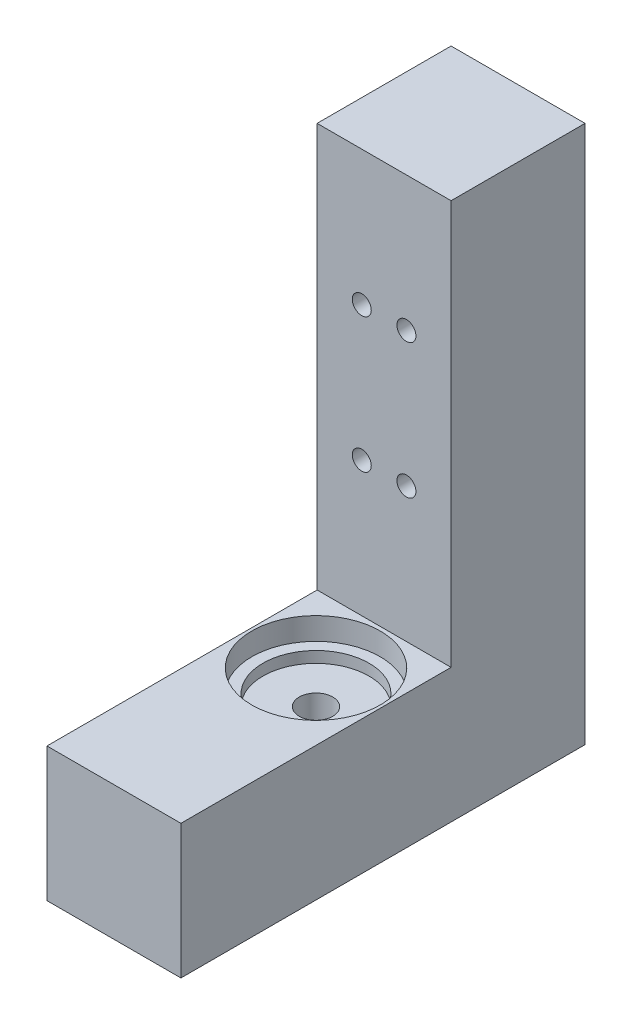
ISO-10303-21;
HEADER;
FILE_DESCRIPTION(('STEP AP214'),'2;1');
FILE_NAME('part.step','',(''),(''),'','','');
FILE_SCHEMA(('AUTOMOTIVE_DESIGN { 1 0 10303 214 1 1 1 1 }'));
ENDSEC;
DATA;
#1=APPLICATION_CONTEXT('core data for automotive mechanical design processes');
#2=APPLICATION_PROTOCOL_DEFINITION('international standard','automotive_design',2000,#1);
#3=PRODUCT_CONTEXT('',#1,'mechanical');
#4=PRODUCT('Part','Part','',(#3));
#5=PRODUCT_RELATED_PRODUCT_CATEGORY('part','',(#4));
#6=PRODUCT_DEFINITION_FORMATION('','',#4);
#7=PRODUCT_DEFINITION_CONTEXT('part definition',#1,'design');
#8=PRODUCT_DEFINITION('design','',#6,#7);
#9=PRODUCT_DEFINITION_SHAPE('','',#8);
#10=(LENGTH_UNIT() NAMED_UNIT(*) SI_UNIT(.MILLI.,.METRE.));
#11=(NAMED_UNIT(*) PLANE_ANGLE_UNIT() SI_UNIT($,.RADIAN.));
#12=(NAMED_UNIT(*) SI_UNIT($,.STERADIAN.) SOLID_ANGLE_UNIT());
#13=UNCERTAINTY_MEASURE_WITH_UNIT(LENGTH_MEASURE(1.E-05),#10,'distance_accuracy_value','');
#14=(GEOMETRIC_REPRESENTATION_CONTEXT(3) GLOBAL_UNCERTAINTY_ASSIGNED_CONTEXT((#13)) GLOBAL_UNIT_ASSIGNED_CONTEXT((#10,
#11,#12)) REPRESENTATION_CONTEXT('',''));
#15=CARTESIAN_POINT('',(0.,0.,0.));
#16=DIRECTION('',(0.,0.,1.));
#17=DIRECTION('',(1.,0.,0.));
#18=AXIS2_PLACEMENT_3D('',#15,#16,#17);
#19=CARTESIAN_POINT('',(16.,48.1366666666667,0.));
#20=DIRECTION('',(0.,0.,1.));
#21=DIRECTION('',(1.,0.,0.));
#22=AXIS2_PLACEMENT_3D('',#19,#20,#21);
#23=CYLINDRICAL_SURFACE('',#22,1.7);
#24=CARTESIAN_POINT('',(16.,48.1366666666667,0.));
#25=DIRECTION('',(0.,0.,1.));
#26=DIRECTION('',(1.,0.,0.));
#27=AXIS2_PLACEMENT_3D('',#24,#25,#26);
#28=CIRCLE('',#27,1.7);
#29=CARTESIAN_POINT('',(17.7,48.1366666666667,0.));
#30=VERTEX_POINT('',#29);
#31=EDGE_CURVE('E49',#30,#30,#28,.T.);
#32=ORIENTED_EDGE('',*,*,#31,.F.);
#33=EDGE_LOOP('',(#32));
#34=FACE_BOUND('',#33,.T.);
#35=CARTESIAN_POINT('',(16.,48.1366666666667,24.));
#36=DIRECTION('',(0.,0.,-1.));
#37=DIRECTION('',(-1.,0.,0.));
#38=AXIS2_PLACEMENT_3D('',#35,#36,#37);
#39=CIRCLE('',#38,1.7);
#40=CARTESIAN_POINT('',(14.3,48.1366666666667,24.));
#41=VERTEX_POINT('',#40);
#42=EDGE_CURVE('E11',#41,#41,#39,.T.);
#43=ORIENTED_EDGE('',*,*,#42,.F.);
#44=EDGE_LOOP('',(#43));
#45=FACE_BOUND('',#44,.T.);
#46=ADVANCED_FACE('F41',(#34,#45),#23,.F.);
#47=CARTESIAN_POINT('',(8.,48.1366666666667,0.));
#48=DIRECTION('',(0.,0.,1.));
#49=DIRECTION('',(1.,0.,0.));
#50=AXIS2_PLACEMENT_3D('',#47,#48,#49);
#51=CYLINDRICAL_SURFACE('',#50,1.7);
#52=CARTESIAN_POINT('',(8.,48.1366666666667,0.));
#53=DIRECTION('',(0.,0.,1.));
#54=DIRECTION('',(1.,0.,0.));
#55=AXIS2_PLACEMENT_3D('',#52,#53,#54);
#56=CIRCLE('',#55,1.7);
#57=CARTESIAN_POINT('',(9.70000000000001,48.1366666666667,0.));
#58=VERTEX_POINT('',#57);
#59=EDGE_CURVE('E165',#58,#58,#56,.T.);
#60=ORIENTED_EDGE('',*,*,#59,.F.);
#61=EDGE_LOOP('',(#60));
#62=FACE_BOUND('',#61,.T.);
#63=CARTESIAN_POINT('',(8.,48.1366666666667,24.));
#64=DIRECTION('',(0.,0.,-1.));
#65=DIRECTION('',(-1.,0.,0.));
#66=AXIS2_PLACEMENT_3D('',#63,#64,#65);
#67=CIRCLE('',#66,1.7);
#68=CARTESIAN_POINT('',(6.3,48.1366666666667,24.));
#69=VERTEX_POINT('',#68);
#70=EDGE_CURVE('E174',#69,#69,#67,.T.);
#71=ORIENTED_EDGE('',*,*,#70,.F.);
#72=EDGE_LOOP('',(#71));
#73=FACE_BOUND('',#72,.T.);
#74=ADVANCED_FACE('F186',(#62,#73),#51,.F.);
#75=CARTESIAN_POINT('',(24.,24.,0.));
#76=DIRECTION('',(0.,-1.,0.));
#77=DIRECTION('',(0.,0.,-1.));
#78=AXIS2_PLACEMENT_3D('',#75,#76,#77);
#79=PLANE('',#78);
#80=CARTESIAN_POINT('',(12.,24.,36.2));
#81=DIRECTION('',(0.,1.,0.));
#82=DIRECTION('',(0.,0.,1.));
#83=AXIS2_PLACEMENT_3D('',#80,#81,#82);
#84=CIRCLE('',#83,11.5);
#85=CARTESIAN_POINT('',(12.,24.,47.7));
#86=VERTEX_POINT('',#85);
#87=EDGE_CURVE('E390',#86,#86,#84,.T.);
#88=ORIENTED_EDGE('',*,*,#87,.F.);
#89=EDGE_LOOP('',(#88));
#90=FACE_BOUND('',#89,.T.);
#91=DIRECTION('',(1.,0.,0.));
#92=VECTOR('',#91,1.);
#93=CARTESIAN_POINT('',(0.,24.,24.));
#94=LINE('',#93,#92);
#95=CARTESIAN_POINT('',(0.,24.,24.));
#96=VERTEX_POINT('',#95);
#97=CARTESIAN_POINT('',(24.,24.,24.));
#98=VERTEX_POINT('',#97);
#99=EDGE_CURVE('E56',#96,#98,#94,.T.);
#100=ORIENTED_EDGE('',*,*,#99,.F.);
#101=DIRECTION('',(0.,0.,1.));
#102=VECTOR('',#101,1.);
#103=CARTESIAN_POINT('',(0.,24.,0.));
#104=LINE('',#103,#102);
#105=CARTESIAN_POINT('',(0.,24.,72.4));
#106=VERTEX_POINT('',#105);
#107=EDGE_CURVE('E127',#96,#106,#104,.T.);
#108=ORIENTED_EDGE('',*,*,#107,.T.);
#109=DIRECTION('',(-1.,0.,0.));
#110=VECTOR('',#109,1.);
#111=CARTESIAN_POINT('',(24.,24.,72.4));
#112=LINE('',#111,#110);
#113=CARTESIAN_POINT('',(24.,24.,72.4));
#114=VERTEX_POINT('',#113);
#115=EDGE_CURVE('E161',#114,#106,#112,.T.);
#116=ORIENTED_EDGE('',*,*,#115,.F.);
#117=DIRECTION('',(0.,0.,1.));
#118=VECTOR('',#117,1.);
#119=CARTESIAN_POINT('',(24.,24.,0.));
#120=LINE('',#119,#118);
#121=EDGE_CURVE('E85',#98,#114,#120,.T.);
#122=ORIENTED_EDGE('',*,*,#121,.F.);
#123=EDGE_LOOP('',(#100,#108,#116,#122));
#124=FACE_BOUND('',#123,.T.);
#125=ADVANCED_FACE('F215',(#90,#124),#79,.F.);
#126=CARTESIAN_POINT('',(24.,0.,0.));
#127=DIRECTION('',(0.,0.,1.));
#128=DIRECTION('',(1.,0.,0.));
#129=AXIS2_PLACEMENT_3D('',#126,#127,#128);
#130=PLANE('',#129);
#131=CARTESIAN_POINT('',(16.,72.2666666666667,0.));
#132=DIRECTION('',(0.,0.,1.));
#133=DIRECTION('',(1.,0.,0.));
#134=AXIS2_PLACEMENT_3D('',#131,#132,#133);
#135=CIRCLE('',#134,1.7);
#136=CARTESIAN_POINT('',(17.7,72.2666666666667,0.));
#137=VERTEX_POINT('',#136);
#138=EDGE_CURVE('E360',#137,#137,#135,.T.);
#139=ORIENTED_EDGE('',*,*,#138,.T.);
#140=EDGE_LOOP('',(#139));
#141=FACE_BOUND('',#140,.T.);
#142=CARTESIAN_POINT('',(8.,72.2666666666667,0.));
#143=DIRECTION('',(0.,0.,1.));
#144=DIRECTION('',(1.,0.,0.));
#145=AXIS2_PLACEMENT_3D('',#142,#143,#144);
#146=CIRCLE('',#145,1.7);
#147=CARTESIAN_POINT('',(9.70000000000001,72.2666666666667,0.));
#148=VERTEX_POINT('',#147);
#149=EDGE_CURVE('E170',#148,#148,#146,.T.);
#150=ORIENTED_EDGE('',*,*,#149,.T.);
#151=EDGE_LOOP('',(#150));
#152=FACE_BOUND('',#151,.T.);
#153=DIRECTION('',(0.,1.,0.));
#154=VECTOR('',#153,1.);
#155=CARTESIAN_POINT('',(0.,0.,0.));
#156=LINE('',#155,#154);
#157=CARTESIAN_POINT('',(0.,0.,0.));
#158=VERTEX_POINT('',#157);
#159=CARTESIAN_POINT('',(0.,96.4,0.));
#160=VERTEX_POINT('',#159);
#161=EDGE_CURVE('E129',#158,#160,#156,.T.);
#162=ORIENTED_EDGE('',*,*,#161,.T.);
#163=DIRECTION('',(-1.,0.,0.));
#164=VECTOR('',#163,1.);
#165=CARTESIAN_POINT('',(0.,96.4,0.));
#166=LINE('',#165,#164);
#167=CARTESIAN_POINT('',(24.,96.4,0.));
#168=VERTEX_POINT('',#167);
#169=EDGE_CURVE('E120',#168,#160,#166,.T.);
#170=ORIENTED_EDGE('',*,*,#169,.F.);
#171=DIRECTION('',(0.,1.,0.));
#172=VECTOR('',#171,1.);
#173=CARTESIAN_POINT('',(24.,0.,0.));
#174=LINE('',#173,#172);
#175=CARTESIAN_POINT('',(24.,0.,0.));
#176=VERTEX_POINT('',#175);
#177=EDGE_CURVE('E138',#176,#168,#174,.T.);
#178=ORIENTED_EDGE('',*,*,#177,.F.);
#179=DIRECTION('',(-1.,0.,0.));
#180=VECTOR('',#179,1.);
#181=CARTESIAN_POINT('',(24.,0.,0.));
#182=LINE('',#181,#180);
#183=EDGE_CURVE('E147',#176,#158,#182,.T.);
#184=ORIENTED_EDGE('',*,*,#183,.T.);
#185=EDGE_LOOP('',(#162,#170,#178,#184));
#186=FACE_BOUND('',#185,.T.);
#187=ORIENTED_EDGE('',*,*,#59,.T.);
#188=EDGE_LOOP('',(#187));
#189=FACE_BOUND('',#188,.T.);
#190=ORIENTED_EDGE('',*,*,#31,.T.);
#191=EDGE_LOOP('',(#190));
#192=FACE_BOUND('',#191,.T.);
#193=ADVANCED_FACE('F182',(#141,#152,#186,#189,#192),#130,.F.);
#194=CARTESIAN_POINT('',(24.,0.,72.4));
#195=DIRECTION('',(0.,0.,-1.));
#196=DIRECTION('',(0.,1.,0.));
#197=AXIS2_PLACEMENT_3D('',#194,#195,#196);
#198=PLANE('',#197);
#199=DIRECTION('',(0.,-1.,0.));
#200=VECTOR('',#199,1.);
#201=CARTESIAN_POINT('',(0.,0.,72.4));
#202=LINE('',#201,#200);
#203=CARTESIAN_POINT('',(0.,0.,72.4));
#204=VERTEX_POINT('',#203);
#205=EDGE_CURVE('E151',#106,#204,#202,.T.);
#206=ORIENTED_EDGE('',*,*,#205,.T.);
#207=DIRECTION('',(-1.,0.,0.));
#208=VECTOR('',#207,1.);
#209=CARTESIAN_POINT('',(24.,0.,72.4));
#210=LINE('',#209,#208);
#211=CARTESIAN_POINT('',(24.,0.,72.4));
#212=VERTEX_POINT('',#211);
#213=EDGE_CURVE('E158',#212,#204,#210,.T.);
#214=ORIENTED_EDGE('',*,*,#213,.F.);
#215=DIRECTION('',(0.,-1.,0.));
#216=VECTOR('',#215,1.);
#217=CARTESIAN_POINT('',(24.,0.,72.4));
#218=LINE('',#217,#216);
#219=EDGE_CURVE('E143',#114,#212,#218,.T.);
#220=ORIENTED_EDGE('',*,*,#219,.F.);
#221=ORIENTED_EDGE('',*,*,#115,.T.);
#222=EDGE_LOOP('',(#206,#214,#220,#221));
#223=FACE_BOUND('',#222,.T.);
#224=ADVANCED_FACE('F211',(#223),#198,.F.);
#225=CARTESIAN_POINT('',(24.,0.,0.));
#226=DIRECTION('',(0.,1.,0.));
#227=DIRECTION('',(0.,0.,1.));
#228=AXIS2_PLACEMENT_3D('',#225,#226,#227);
#229=PLANE('',#228);
#230=DIRECTION('',(0.,0.,-1.));
#231=VECTOR('',#230,1.);
#232=CARTESIAN_POINT('',(0.,0.,0.));
#233=LINE('',#232,#231);
#234=EDGE_CURVE('E81',#204,#158,#233,.T.);
#235=ORIENTED_EDGE('',*,*,#234,.T.);
#236=ORIENTED_EDGE('',*,*,#183,.F.);
#237=DIRECTION('',(0.,0.,-1.));
#238=VECTOR('',#237,1.);
#239=CARTESIAN_POINT('',(24.,0.,0.));
#240=LINE('',#239,#238);
#241=EDGE_CURVE('E65',#212,#176,#240,.T.);
#242=ORIENTED_EDGE('',*,*,#241,.F.);
#243=ORIENTED_EDGE('',*,*,#213,.T.);
#244=EDGE_LOOP('',(#235,#236,#242,#243));
#245=FACE_BOUND('',#244,.T.);
#246=ADVANCED_FACE('F207',(#245),#229,.F.);
#247=CARTESIAN_POINT('',(24.,0.,0.));
#248=DIRECTION('',(1.,0.,0.));
#249=DIRECTION('',(0.,0.,-1.));
#250=AXIS2_PLACEMENT_3D('',#247,#248,#249);
#251=PLANE('',#250);
#252=ORIENTED_EDGE('',*,*,#177,.T.);
#253=DIRECTION('',(0.,0.,-1.));
#254=VECTOR('',#253,1.);
#255=CARTESIAN_POINT('',(24.,96.4,0.));
#256=LINE('',#255,#254);
#257=CARTESIAN_POINT('',(24.,96.4,24.));
#258=VERTEX_POINT('',#257);
#259=EDGE_CURVE('E113',#258,#168,#256,.T.);
#260=ORIENTED_EDGE('',*,*,#259,.F.);
#261=DIRECTION('',(0.,-1.,0.));
#262=VECTOR('',#261,1.);
#263=CARTESIAN_POINT('',(24.,96.4,24.));
#264=LINE('',#263,#262);
#265=EDGE_CURVE('E108',#258,#98,#264,.T.);
#266=ORIENTED_EDGE('',*,*,#265,.T.);
#267=ORIENTED_EDGE('',*,*,#121,.T.);
#268=ORIENTED_EDGE('',*,*,#219,.T.);
#269=ORIENTED_EDGE('',*,*,#241,.T.);
#270=EDGE_LOOP('',(#252,#260,#266,#267,#268,#269));
#271=FACE_BOUND('',#270,.T.);
#272=ADVANCED_FACE('F200',(#271),#251,.T.);
#273=CARTESIAN_POINT('',(0.,0.,0.));
#274=DIRECTION('',(1.,0.,0.));
#275=DIRECTION('',(0.,0.,-1.));
#276=AXIS2_PLACEMENT_3D('',#273,#274,#275);
#277=PLANE('',#276);
#278=ORIENTED_EDGE('',*,*,#161,.F.);
#279=ORIENTED_EDGE('',*,*,#234,.F.);
#280=ORIENTED_EDGE('',*,*,#205,.F.);
#281=ORIENTED_EDGE('',*,*,#107,.F.);
#282=DIRECTION('',(0.,-1.,0.));
#283=VECTOR('',#282,1.);
#284=CARTESIAN_POINT('',(0.,96.4,24.));
#285=LINE('',#284,#283);
#286=CARTESIAN_POINT('',(0.,96.4,24.));
#287=VERTEX_POINT('',#286);
#288=EDGE_CURVE('E107',#287,#96,#285,.T.);
#289=ORIENTED_EDGE('',*,*,#288,.F.);
#290=DIRECTION('',(0.,0.,1.));
#291=VECTOR('',#290,1.);
#292=CARTESIAN_POINT('',(0.,96.4,0.));
#293=LINE('',#292,#291);
#294=EDGE_CURVE('E114',#160,#287,#293,.T.);
#295=ORIENTED_EDGE('',*,*,#294,.F.);
#296=EDGE_LOOP('',(#278,#279,#280,#281,#289,#295));
#297=FACE_BOUND('',#296,.T.);
#298=ADVANCED_FACE('F125',(#297),#277,.F.);
#299=CARTESIAN_POINT('',(0.,96.4,24.));
#300=DIRECTION('',(0.,0.,-1.));
#301=DIRECTION('',(-1.,0.,0.));
#302=AXIS2_PLACEMENT_3D('',#299,#300,#301);
#303=PLANE('',#302);
#304=CARTESIAN_POINT('',(16.,72.2666666666667,24.));
#305=DIRECTION('',(0.,0.,-1.));
#306=DIRECTION('',(-1.,0.,0.));
#307=AXIS2_PLACEMENT_3D('',#304,#305,#306);
#308=CIRCLE('',#307,1.7);
#309=CARTESIAN_POINT('',(14.3,72.2666666666667,24.));
#310=VERTEX_POINT('',#309);
#311=EDGE_CURVE('E362',#310,#310,#308,.T.);
#312=ORIENTED_EDGE('',*,*,#311,.T.);
#313=EDGE_LOOP('',(#312));
#314=FACE_BOUND('',#313,.T.);
#315=CARTESIAN_POINT('',(8.,72.2666666666667,24.));
#316=DIRECTION('',(0.,0.,-1.));
#317=DIRECTION('',(-1.,0.,0.));
#318=AXIS2_PLACEMENT_3D('',#315,#316,#317);
#319=CIRCLE('',#318,1.7);
#320=CARTESIAN_POINT('',(6.3,72.2666666666667,24.));
#321=VERTEX_POINT('',#320);
#322=EDGE_CURVE('E166',#321,#321,#319,.T.);
#323=ORIENTED_EDGE('',*,*,#322,.T.);
#324=EDGE_LOOP('',(#323));
#325=FACE_BOUND('',#324,.T.);
#326=ORIENTED_EDGE('',*,*,#99,.T.);
#327=ORIENTED_EDGE('',*,*,#265,.F.);
#328=DIRECTION('',(1.,0.,0.));
#329=VECTOR('',#328,1.);
#330=CARTESIAN_POINT('',(0.,96.4,24.));
#331=LINE('',#330,#329);
#332=EDGE_CURVE('E102',#287,#258,#331,.T.);
#333=ORIENTED_EDGE('',*,*,#332,.F.);
#334=ORIENTED_EDGE('',*,*,#288,.T.);
#335=EDGE_LOOP('',(#326,#327,#333,#334));
#336=FACE_BOUND('',#335,.T.);
#337=ORIENTED_EDGE('',*,*,#70,.T.);
#338=EDGE_LOOP('',(#337));
#339=FACE_BOUND('',#338,.T.);
#340=ORIENTED_EDGE('',*,*,#42,.T.);
#341=EDGE_LOOP('',(#340));
#342=FACE_BOUND('',#341,.T.);
#343=ADVANCED_FACE('F104',(#314,#325,#336,#339,#342),#303,.F.);
#344=CARTESIAN_POINT('',(0.,96.4,0.));
#345=DIRECTION('',(0.,1.,0.));
#346=DIRECTION('',(0.,0.,1.));
#347=AXIS2_PLACEMENT_3D('',#344,#345,#346);
#348=PLANE('',#347);
#349=ORIENTED_EDGE('',*,*,#294,.T.);
#350=ORIENTED_EDGE('',*,*,#332,.T.);
#351=ORIENTED_EDGE('',*,*,#259,.T.);
#352=ORIENTED_EDGE('',*,*,#169,.T.);
#353=EDGE_LOOP('',(#349,#350,#351,#352));
#354=FACE_BOUND('',#353,.T.);
#355=ADVANCED_FACE('F118',(#354),#348,.T.);
#356=CARTESIAN_POINT('',(8.,72.2666666666667,0.));
#357=DIRECTION('',(0.,0.,1.));
#358=DIRECTION('',(1.,0.,0.));
#359=AXIS2_PLACEMENT_3D('',#356,#357,#358);
#360=CYLINDRICAL_SURFACE('',#359,1.7);
#361=ORIENTED_EDGE('',*,*,#149,.F.);
#362=EDGE_LOOP('',(#361));
#363=FACE_BOUND('',#362,.T.);
#364=ORIENTED_EDGE('',*,*,#322,.F.);
#365=EDGE_LOOP('',(#364));
#366=FACE_BOUND('',#365,.T.);
#367=ADVANCED_FACE('F197',(#363,#366),#360,.F.);
#368=CARTESIAN_POINT('',(16.,72.2666666666667,0.));
#369=DIRECTION('',(0.,0.,1.));
#370=DIRECTION('',(1.,0.,0.));
#371=AXIS2_PLACEMENT_3D('',#368,#369,#370);
#372=CYLINDRICAL_SURFACE('',#371,1.7);
#373=ORIENTED_EDGE('',*,*,#138,.F.);
#374=EDGE_LOOP('',(#373));
#375=FACE_BOUND('',#374,.T.);
#376=ORIENTED_EDGE('',*,*,#311,.F.);
#377=EDGE_LOOP('',(#376));
#378=FACE_BOUND('',#377,.T.);
#379=ADVANCED_FACE('F279',(#375,#378),#372,.F.);
#380=CARTESIAN_POINT('',(12.,20.,36.2));
#381=DIRECTION('',(0.,1.,0.));
#382=DIRECTION('',(0.,0.,1.));
#383=AXIS2_PLACEMENT_3D('',#380,#381,#382);
#384=CYLINDRICAL_SURFACE('',#383,11.5);
#385=CARTESIAN_POINT('',(12.,20.,36.2));
#386=DIRECTION('',(0.,1.,0.));
#387=DIRECTION('',(0.,0.,1.));
#388=AXIS2_PLACEMENT_3D('',#385,#386,#387);
#389=CIRCLE('',#388,11.5);
#390=CARTESIAN_POINT('',(12.,20.,47.7));
#391=VERTEX_POINT('',#390);
#392=EDGE_CURVE('E370',#391,#391,#389,.T.);
#393=ORIENTED_EDGE('',*,*,#392,.F.);
#394=EDGE_LOOP('',(#393));
#395=FACE_BOUND('',#394,.T.);
#396=ORIENTED_EDGE('',*,*,#87,.T.);
#397=EDGE_LOOP('',(#396));
#398=FACE_BOUND('',#397,.T.);
#399=ADVANCED_FACE('F290',(#395,#398),#384,.F.);
#400=CARTESIAN_POINT('',(12.,20.,36.2));
#401=DIRECTION('',(0.,1.,0.));
#402=DIRECTION('',(0.,0.,1.));
#403=AXIS2_PLACEMENT_3D('',#400,#401,#402);
#404=PLANE('',#403);
#405=CARTESIAN_POINT('',(12.,20.,36.2));
#406=DIRECTION('',(0.,1.,0.));
#407=DIRECTION('',(0.,0.,1.));
#408=AXIS2_PLACEMENT_3D('',#405,#406,#407);
#409=CIRCLE('',#408,9.5);
#410=CARTESIAN_POINT('',(12.,20.,45.7));
#411=VERTEX_POINT('',#410);
#412=EDGE_CURVE('E398',#411,#411,#409,.T.);
#413=ORIENTED_EDGE('',*,*,#412,.F.);
#414=EDGE_LOOP('',(#413));
#415=FACE_BOUND('',#414,.T.);
#416=ORIENTED_EDGE('',*,*,#392,.T.);
#417=EDGE_LOOP('',(#416));
#418=FACE_BOUND('',#417,.T.);
#419=ADVANCED_FACE('F295',(#415,#418),#404,.T.);
#420=CARTESIAN_POINT('',(12.,18.,36.2));
#421=DIRECTION('',(0.,1.,0.));
#422=DIRECTION('',(0.,0.,1.));
#423=AXIS2_PLACEMENT_3D('',#420,#421,#422);
#424=CYLINDRICAL_SURFACE('',#423,9.5);
#425=CARTESIAN_POINT('',(12.,18.,36.2));
#426=DIRECTION('',(0.,1.,0.));
#427=DIRECTION('',(0.,0.,1.));
#428=AXIS2_PLACEMENT_3D('',#425,#426,#427);
#429=CIRCLE('',#428,9.5);
#430=CARTESIAN_POINT('',(12.,18.,45.7));
#431=VERTEX_POINT('',#430);
#432=EDGE_CURVE('E394',#431,#431,#429,.T.);
#433=ORIENTED_EDGE('',*,*,#432,.F.);
#434=EDGE_LOOP('',(#433));
#435=FACE_BOUND('',#434,.T.);
#436=ORIENTED_EDGE('',*,*,#412,.T.);
#437=EDGE_LOOP('',(#436));
#438=FACE_BOUND('',#437,.T.);
#439=ADVANCED_FACE('F304',(#435,#438),#424,.F.);
#440=CARTESIAN_POINT('',(12.,18.,36.2));
#441=DIRECTION('',(0.,1.,0.));
#442=DIRECTION('',(0.,0.,1.));
#443=AXIS2_PLACEMENT_3D('',#440,#441,#442);
#444=PLANE('',#443);
#445=CARTESIAN_POINT('',(12.,18.,36.2));
#446=DIRECTION('',(0.,1.,0.));
#447=DIRECTION('',(0.,0.,1.));
#448=AXIS2_PLACEMENT_3D('',#445,#446,#447);
#449=CIRCLE('',#448,3.);
#450=CARTESIAN_POINT('',(12.,18.,39.2));
#451=VERTEX_POINT('',#450);
#452=EDGE_CURVE('E406',#451,#451,#449,.T.);
#453=ORIENTED_EDGE('',*,*,#452,.F.);
#454=EDGE_LOOP('',(#453));
#455=FACE_BOUND('',#454,.T.);
#456=ORIENTED_EDGE('',*,*,#432,.T.);
#457=EDGE_LOOP('',(#456));
#458=FACE_BOUND('',#457,.T.);
#459=ADVANCED_FACE('F313',(#455,#458),#444,.T.);
#460=CARTESIAN_POINT('',(12.,11.,36.2));
#461=DIRECTION('',(0.,1.,0.));
#462=DIRECTION('',(0.,0.,1.));
#463=AXIS2_PLACEMENT_3D('',#460,#461,#462);
#464=CYLINDRICAL_SURFACE('',#463,3.);
#465=CARTESIAN_POINT('',(12.,11.,36.2));
#466=DIRECTION('',(0.,1.,0.));
#467=DIRECTION('',(0.,0.,1.));
#468=AXIS2_PLACEMENT_3D('',#465,#466,#467);
#469=CIRCLE('',#468,3.);
#470=CARTESIAN_POINT('',(12.,11.,39.2));
#471=VERTEX_POINT('',#470);
#472=EDGE_CURVE('E402',#471,#471,#469,.T.);
#473=ORIENTED_EDGE('',*,*,#472,.F.);
#474=EDGE_LOOP('',(#473));
#475=FACE_BOUND('',#474,.T.);
#476=ORIENTED_EDGE('',*,*,#452,.T.);
#477=EDGE_LOOP('',(#476));
#478=FACE_BOUND('',#477,.T.);
#479=ADVANCED_FACE('F322',(#475,#478),#464,.F.);
#480=CARTESIAN_POINT('',(12.,11.,36.2));
#481=DIRECTION('',(0.,1.,0.));
#482=DIRECTION('',(0.,0.,1.));
#483=AXIS2_PLACEMENT_3D('',#480,#481,#482);
#484=PLANE('',#483);
#485=ORIENTED_EDGE('',*,*,#472,.T.);
#486=EDGE_LOOP('',(#485));
#487=FACE_BOUND('',#486,.T.);
#488=ADVANCED_FACE('F331',(#487),#484,.T.);
#489=CLOSED_SHELL('',(#46,#74,#125,#193,#224,#246,#272,#298,#343,#355,#367,#379,#399,#419,#439,
#459,#479,#488));
#490=MANIFOLD_SOLID_BREP('B2',#489);
#491=ADVANCED_BREP_SHAPE_REPRESENTATION('',(#18,#490),#14);
#492=SHAPE_DEFINITION_REPRESENTATION(#9,#491);
ENDSEC;
END-ISO-10303-21;
